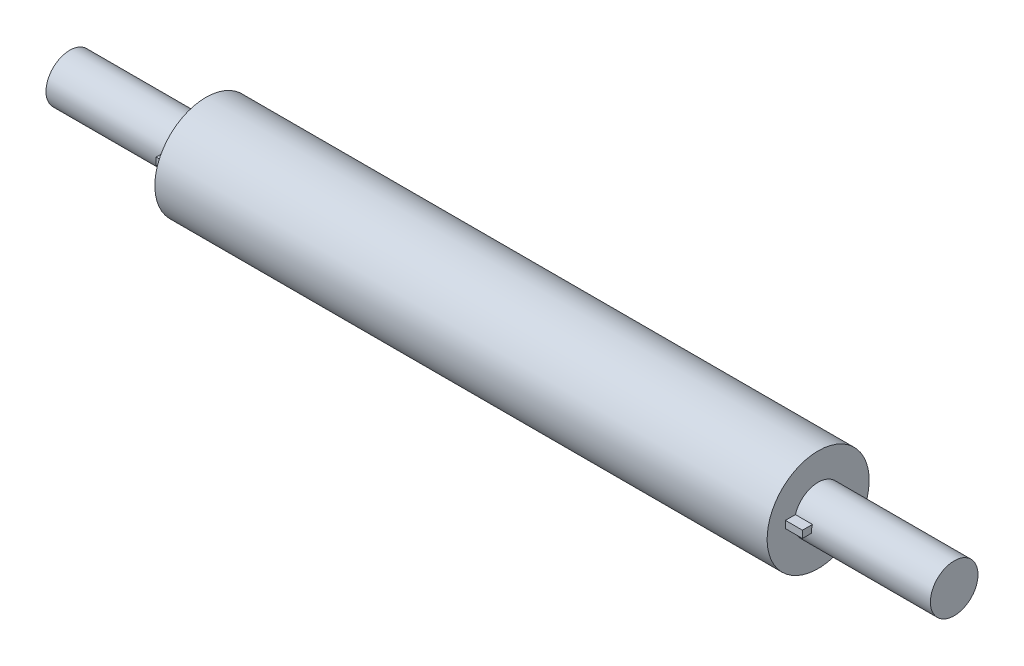
ISO-10303-21;
HEADER;
FILE_DESCRIPTION(('STEP AP214'),'2;1');
FILE_NAME('part.step','',(''),(''),'','','');
FILE_SCHEMA(('AUTOMOTIVE_DESIGN { 1 0 10303 214 1 1 1 1 }'));
ENDSEC;
DATA;
#1=APPLICATION_CONTEXT('core data for automotive mechanical design processes');
#2=APPLICATION_PROTOCOL_DEFINITION('international standard','automotive_design',2000,#1);
#3=PRODUCT_CONTEXT('',#1,'mechanical');
#4=PRODUCT('Part','Part','',(#3));
#5=PRODUCT_RELATED_PRODUCT_CATEGORY('part','',(#4));
#6=PRODUCT_DEFINITION_FORMATION('','',#4);
#7=PRODUCT_DEFINITION_CONTEXT('part definition',#1,'design');
#8=PRODUCT_DEFINITION('design','',#6,#7);
#9=PRODUCT_DEFINITION_SHAPE('','',#8);
#10=(LENGTH_UNIT() NAMED_UNIT(*) SI_UNIT(.MILLI.,.METRE.));
#11=(NAMED_UNIT(*) PLANE_ANGLE_UNIT() SI_UNIT($,.RADIAN.));
#12=(NAMED_UNIT(*) SI_UNIT($,.STERADIAN.) SOLID_ANGLE_UNIT());
#13=UNCERTAINTY_MEASURE_WITH_UNIT(LENGTH_MEASURE(1.E-05),#10,'distance_accuracy_value','');
#14=(GEOMETRIC_REPRESENTATION_CONTEXT(3) GLOBAL_UNCERTAINTY_ASSIGNED_CONTEXT((#13)) GLOBAL_UNIT_ASSIGNED_CONTEXT((#10,
#11,#12)) REPRESENTATION_CONTEXT('',''));
#15=CARTESIAN_POINT('',(0.,0.,0.));
#16=DIRECTION('',(0.,0.,1.));
#17=DIRECTION('',(1.,0.,0.));
#18=AXIS2_PLACEMENT_3D('',#15,#16,#17);
#19=CARTESIAN_POINT('',(90.,-7.00000000000002,0.));
#20=DIRECTION('',(-1.,0.,0.));
#21=DIRECTION('',(0.,-1.,0.));
#22=AXIS2_PLACEMENT_3D('',#19,#20,#21);
#23=PLANE('',#22);
#24=CARTESIAN_POINT('',(90.,0.,0.));
#25=DIRECTION('',(1.,0.,0.));
#26=DIRECTION('',(0.,1.,0.));
#27=AXIS2_PLACEMENT_3D('',#24,#25,#26);
#28=CIRCLE('',#27,15.);
#29=CARTESIAN_POINT('',(90.,15.,0.));
#30=VERTEX_POINT('',#29);
#31=EDGE_CURVE('E155',#30,#30,#28,.T.);
#32=ORIENTED_EDGE('',*,*,#31,.T.);
#33=EDGE_LOOP('',(#32));
#34=FACE_BOUND('',#33,.T.);
#35=DIRECTION('',(0.,0.,1.));
#36=VECTOR('',#35,1.);
#37=CARTESIAN_POINT('',(90.,2.10331663420971,9.61193085525656));
#38=LINE('',#37,#36);
#39=CARTESIAN_POINT('',(90.,2.10331663420971,6.67653047145425));
#40=VERTEX_POINT('',#39);
#41=CARTESIAN_POINT('',(90.,2.10331663420971,9.61193085525656));
#42=VERTEX_POINT('',#41);
#43=EDGE_CURVE('E126',#40,#42,#38,.T.);
#44=ORIENTED_EDGE('',*,*,#43,.F.);
#45=CARTESIAN_POINT('',(90.,0.,0.));
#46=DIRECTION('',(1.,0.,0.));
#47=DIRECTION('',(0.,1.,0.));
#48=AXIS2_PLACEMENT_3D('',#45,#46,#47);
#49=CIRCLE('',#48,7.00000000000002);
#50=CARTESIAN_POINT('',(90.,0.,7.00000000000002));
#51=VERTEX_POINT('',#50);
#52=EDGE_CURVE('E11',#51,#40,#49,.T.);
#53=ORIENTED_EDGE('',*,*,#52,.F.);
#54=DIRECTION('',(0.,0.,-1.));
#55=VECTOR('',#54,1.);
#56=CARTESIAN_POINT('',(90.,0.,7.00000000000002));
#57=LINE('',#56,#55);
#58=CARTESIAN_POINT('',(90.,0.,9.61193085525656));
#59=VERTEX_POINT('',#58);
#60=EDGE_CURVE('E138',#59,#51,#57,.T.);
#61=ORIENTED_EDGE('',*,*,#60,.F.);
#62=DIRECTION('',(0.,-1.,0.));
#63=VECTOR('',#62,1.);
#64=CARTESIAN_POINT('',(90.,0.,9.61193085525656));
#65=LINE('',#64,#63);
#66=EDGE_CURVE('E128',#42,#59,#65,.T.);
#67=ORIENTED_EDGE('',*,*,#66,.F.);
#68=EDGE_LOOP('',(#44,#53,#61,#67));
#69=FACE_BOUND('',#68,.T.);
#70=ADVANCED_FACE('F34',(#34,#69),#23,.F.);
#71=CARTESIAN_POINT('',(130.,0.,0.));
#72=DIRECTION('',(1.,0.,0.));
#73=DIRECTION('',(0.,1.,0.));
#74=AXIS2_PLACEMENT_3D('',#71,#72,#73);
#75=CYLINDRICAL_SURFACE('',#74,7.00000000000001);
#76=CARTESIAN_POINT('',(130.,0.,0.));
#77=DIRECTION('',(1.,0.,0.));
#78=DIRECTION('',(0.,1.,0.));
#79=AXIS2_PLACEMENT_3D('',#76,#77,#78);
#80=CIRCLE('',#79,7.);
#81=CARTESIAN_POINT('',(130.,7.,0.));
#82=VERTEX_POINT('',#81);
#83=EDGE_CURVE('E41',#82,#82,#80,.T.);
#84=ORIENTED_EDGE('',*,*,#83,.F.);
#85=EDGE_LOOP('',(#84));
#86=FACE_BOUND('',#85,.T.);
#87=DIRECTION('',(-1.,0.,0.));
#88=VECTOR('',#87,1.);
#89=CARTESIAN_POINT('',(95.,2.10331663420971,6.67653047145425));
#90=LINE('',#89,#88);
#91=CARTESIAN_POINT('',(95.,2.10331663420971,6.67653047145425));
#92=VERTEX_POINT('',#91);
#93=EDGE_CURVE('E153',#92,#40,#90,.T.);
#94=ORIENTED_EDGE('',*,*,#93,.F.);
#95=CARTESIAN_POINT('',(95.,0.,0.));
#96=DIRECTION('',(-1.,0.,0.));
#97=DIRECTION('',(0.,1.,0.));
#98=AXIS2_PLACEMENT_3D('',#95,#96,#97);
#99=CIRCLE('',#98,7.00000000000002);
#100=CARTESIAN_POINT('',(95.,0.,7.00000000000001));
#101=VERTEX_POINT('',#100);
#102=EDGE_CURVE('E134',#101,#92,#99,.T.);
#103=ORIENTED_EDGE('',*,*,#102,.F.);
#104=DIRECTION('',(-1.,0.,0.));
#105=VECTOR('',#104,1.);
#106=CARTESIAN_POINT('',(95.,0.,7.00000000000002));
#107=LINE('',#106,#105);
#108=EDGE_CURVE('E56',#101,#51,#107,.T.);
#109=ORIENTED_EDGE('',*,*,#108,.T.);
#110=ORIENTED_EDGE('',*,*,#52,.T.);
#111=EDGE_LOOP('',(#94,#103,#109,#110));
#112=FACE_BOUND('',#111,.T.);
#113=ADVANCED_FACE('F169',(#86,#112),#75,.T.);
#114=CARTESIAN_POINT('',(130.,0.,0.));
#115=DIRECTION('',(-1.,0.,0.));
#116=DIRECTION('',(0.,-1.,0.));
#117=AXIS2_PLACEMENT_3D('',#114,#115,#116);
#118=PLANE('',#117);
#119=ORIENTED_EDGE('',*,*,#83,.T.);
#120=EDGE_LOOP('',(#119));
#121=FACE_BOUND('',#120,.T.);
#122=ADVANCED_FACE('F167',(#121),#118,.F.);
#123=CARTESIAN_POINT('',(-130.,0.,0.));
#124=DIRECTION('',(1.,0.,0.));
#125=DIRECTION('',(0.,1.,0.));
#126=AXIS2_PLACEMENT_3D('',#123,#124,#125);
#127=PLANE('',#126);
#128=CARTESIAN_POINT('',(-130.,0.,0.));
#129=DIRECTION('',(1.,0.,0.));
#130=DIRECTION('',(0.,1.,0.));
#131=AXIS2_PLACEMENT_3D('',#128,#129,#130);
#132=CIRCLE('',#131,7.);
#133=CARTESIAN_POINT('',(-130.,7.,0.));
#134=VERTEX_POINT('',#133);
#135=EDGE_CURVE('E162',#134,#134,#132,.T.);
#136=ORIENTED_EDGE('',*,*,#135,.F.);
#137=EDGE_LOOP('',(#136));
#138=FACE_BOUND('',#137,.T.);
#139=ADVANCED_FACE('F265',(#138),#127,.F.);
#140=CARTESIAN_POINT('',(130.,0.,0.));
#141=DIRECTION('',(1.,0.,0.));
#142=DIRECTION('',(0.,1.,0.));
#143=AXIS2_PLACEMENT_3D('',#140,#141,#142);
#144=CYLINDRICAL_SURFACE('',#143,7.);
#145=CARTESIAN_POINT('',(-90.,0.,0.));
#146=DIRECTION('',(1.,0.,0.));
#147=DIRECTION('',(0.,1.,0.));
#148=AXIS2_PLACEMENT_3D('',#145,#146,#147);
#149=CIRCLE('',#148,7.);
#150=CARTESIAN_POINT('',(-90.,0.,7.00000000000002));
#151=VERTEX_POINT('',#150);
#152=CARTESIAN_POINT('',(-90.,2.10331663420971,6.67653047145425));
#153=VERTEX_POINT('',#152);
#154=EDGE_CURVE('E125',#151,#153,#149,.T.);
#155=ORIENTED_EDGE('',*,*,#154,.F.);
#156=DIRECTION('',(1.,0.,0.));
#157=VECTOR('',#156,1.);
#158=CARTESIAN_POINT('',(-95.,0.,7.00000000000002));
#159=LINE('',#158,#157);
#160=CARTESIAN_POINT('',(-95.,0.,7.00000000000002));
#161=VERTEX_POINT('',#160);
#162=EDGE_CURVE('E116',#161,#151,#159,.T.);
#163=ORIENTED_EDGE('',*,*,#162,.F.);
#164=CARTESIAN_POINT('',(-95.,0.,0.));
#165=DIRECTION('',(-1.,0.,0.));
#166=DIRECTION('',(0.,1.,0.));
#167=AXIS2_PLACEMENT_3D('',#164,#165,#166);
#168=CIRCLE('',#167,7.00000000000002);
#169=CARTESIAN_POINT('',(-95.,2.10331663420971,6.67653047145425));
#170=VERTEX_POINT('',#169);
#171=EDGE_CURVE('E100',#161,#170,#168,.T.);
#172=ORIENTED_EDGE('',*,*,#171,.T.);
#173=DIRECTION('',(1.,0.,0.));
#174=VECTOR('',#173,1.);
#175=CARTESIAN_POINT('',(-95.,2.10331663420971,6.67653047145425));
#176=LINE('',#175,#174);
#177=EDGE_CURVE('E221',#170,#153,#176,.T.);
#178=ORIENTED_EDGE('',*,*,#177,.T.);
#179=EDGE_LOOP('',(#155,#163,#172,#178));
#180=FACE_BOUND('',#179,.T.);
#181=ORIENTED_EDGE('',*,*,#135,.T.);
#182=EDGE_LOOP('',(#181));
#183=FACE_BOUND('',#182,.T.);
#184=ADVANCED_FACE('F122',(#180,#183),#144,.T.);
#185=CARTESIAN_POINT('',(-90.,-7.,0.));
#186=DIRECTION('',(1.,0.,0.));
#187=DIRECTION('',(0.,1.,0.));
#188=AXIS2_PLACEMENT_3D('',#185,#186,#187);
#189=PLANE('',#188);
#190=CARTESIAN_POINT('',(-90.,0.,0.));
#191=DIRECTION('',(1.,0.,0.));
#192=DIRECTION('',(0.,1.,0.));
#193=AXIS2_PLACEMENT_3D('',#190,#191,#192);
#194=CIRCLE('',#193,15.);
#195=CARTESIAN_POINT('',(-90.,15.,0.));
#196=VERTEX_POINT('',#195);
#197=EDGE_CURVE('E158',#196,#196,#194,.T.);
#198=ORIENTED_EDGE('',*,*,#197,.F.);
#199=EDGE_LOOP('',(#198));
#200=FACE_BOUND('',#199,.T.);
#201=DIRECTION('',(0.,-1.,0.));
#202=VECTOR('',#201,1.);
#203=CARTESIAN_POINT('',(-90.,0.,9.61193085525656));
#204=LINE('',#203,#202);
#205=CARTESIAN_POINT('',(-90.,2.10331663420971,9.61193085525656));
#206=VERTEX_POINT('',#205);
#207=CARTESIAN_POINT('',(-90.,0.,9.61193085525656));
#208=VERTEX_POINT('',#207);
#209=EDGE_CURVE('E48',#206,#208,#204,.T.);
#210=ORIENTED_EDGE('',*,*,#209,.T.);
#211=DIRECTION('',(0.,0.,-1.));
#212=VECTOR('',#211,1.);
#213=CARTESIAN_POINT('',(-90.,0.,7.00000000000002));
#214=LINE('',#213,#212);
#215=EDGE_CURVE('E215',#208,#151,#214,.T.);
#216=ORIENTED_EDGE('',*,*,#215,.T.);
#217=ORIENTED_EDGE('',*,*,#154,.T.);
#218=DIRECTION('',(0.,0.,1.));
#219=VECTOR('',#218,1.);
#220=CARTESIAN_POINT('',(-90.,2.10331663420971,9.61193085525656));
#221=LINE('',#220,#219);
#222=EDGE_CURVE('E111',#153,#206,#221,.T.);
#223=ORIENTED_EDGE('',*,*,#222,.T.);
#224=EDGE_LOOP('',(#210,#216,#217,#223));
#225=FACE_BOUND('',#224,.T.);
#226=ADVANCED_FACE('F207',(#200,#225),#189,.F.);
#227=CARTESIAN_POINT('',(130.,0.,0.));
#228=DIRECTION('',(1.,0.,0.));
#229=DIRECTION('',(0.,1.,0.));
#230=AXIS2_PLACEMENT_3D('',#227,#228,#229);
#231=CYLINDRICAL_SURFACE('',#230,15.);
#232=ORIENTED_EDGE('',*,*,#31,.F.);
#233=EDGE_LOOP('',(#232));
#234=FACE_BOUND('',#233,.T.);
#235=ORIENTED_EDGE('',*,*,#197,.T.);
#236=EDGE_LOOP('',(#235));
#237=FACE_BOUND('',#236,.T.);
#238=ADVANCED_FACE('F204',(#234,#237),#231,.T.);
#239=CARTESIAN_POINT('',(95.,2.10331663420971,9.61193085525656));
#240=DIRECTION('',(0.,-1.,0.));
#241=DIRECTION('',(1.,0.,0.));
#242=AXIS2_PLACEMENT_3D('',#239,#240,#241);
#243=PLANE('',#242);
#244=ORIENTED_EDGE('',*,*,#43,.T.);
#245=DIRECTION('',(-1.,0.,0.));
#246=VECTOR('',#245,1.);
#247=CARTESIAN_POINT('',(95.,2.10331663420971,9.61193085525656));
#248=LINE('',#247,#246);
#249=CARTESIAN_POINT('',(95.,2.10331663420971,9.61193085525656));
#250=VERTEX_POINT('',#249);
#251=EDGE_CURVE('E150',#250,#42,#248,.T.);
#252=ORIENTED_EDGE('',*,*,#251,.F.);
#253=DIRECTION('',(0.,0.,1.));
#254=VECTOR('',#253,1.);
#255=CARTESIAN_POINT('',(95.,2.10331663420971,9.61193085525656));
#256=LINE('',#255,#254);
#257=EDGE_CURVE('E137',#92,#250,#256,.T.);
#258=ORIENTED_EDGE('',*,*,#257,.F.);
#259=ORIENTED_EDGE('',*,*,#93,.T.);
#260=EDGE_LOOP('',(#244,#252,#258,#259));
#261=FACE_BOUND('',#260,.T.);
#262=ADVANCED_FACE('F177',(#261),#243,.F.);
#263=CARTESIAN_POINT('',(95.,0.,9.61193085525656));
#264=DIRECTION('',(0.,0.,-1.));
#265=DIRECTION('',(-1.,0.,0.));
#266=AXIS2_PLACEMENT_3D('',#263,#264,#265);
#267=PLANE('',#266);
#268=ORIENTED_EDGE('',*,*,#66,.T.);
#269=DIRECTION('',(-1.,0.,0.));
#270=VECTOR('',#269,1.);
#271=CARTESIAN_POINT('',(95.,0.,9.61193085525656));
#272=LINE('',#271,#270);
#273=CARTESIAN_POINT('',(95.,0.,9.61193085525656));
#274=VERTEX_POINT('',#273);
#275=EDGE_CURVE('E147',#274,#59,#272,.T.);
#276=ORIENTED_EDGE('',*,*,#275,.F.);
#277=DIRECTION('',(0.,-1.,0.));
#278=VECTOR('',#277,1.);
#279=CARTESIAN_POINT('',(95.,0.,9.61193085525656));
#280=LINE('',#279,#278);
#281=EDGE_CURVE('E140',#250,#274,#280,.T.);
#282=ORIENTED_EDGE('',*,*,#281,.F.);
#283=ORIENTED_EDGE('',*,*,#251,.T.);
#284=EDGE_LOOP('',(#268,#276,#282,#283));
#285=FACE_BOUND('',#284,.T.);
#286=ADVANCED_FACE('F184',(#285),#267,.F.);
#287=CARTESIAN_POINT('',(95.,0.,7.00000000000002));
#288=DIRECTION('',(0.,1.,0.));
#289=DIRECTION('',(-1.,0.,0.));
#290=AXIS2_PLACEMENT_3D('',#287,#288,#289);
#291=PLANE('',#290);
#292=ORIENTED_EDGE('',*,*,#60,.T.);
#293=ORIENTED_EDGE('',*,*,#108,.F.);
#294=DIRECTION('',(0.,0.,-1.));
#295=VECTOR('',#294,1.);
#296=CARTESIAN_POINT('',(95.,0.,7.00000000000002));
#297=LINE('',#296,#295);
#298=EDGE_CURVE('E142',#274,#101,#297,.T.);
#299=ORIENTED_EDGE('',*,*,#298,.F.);
#300=ORIENTED_EDGE('',*,*,#275,.T.);
#301=EDGE_LOOP('',(#292,#293,#299,#300));
#302=FACE_BOUND('',#301,.T.);
#303=ADVANCED_FACE('F186',(#302),#291,.F.);
#304=CARTESIAN_POINT('',(95.,0.,0.));
#305=DIRECTION('',(1.,0.,0.));
#306=DIRECTION('',(0.,1.,0.));
#307=AXIS2_PLACEMENT_3D('',#304,#305,#306);
#308=PLANE('',#307);
#309=ORIENTED_EDGE('',*,*,#102,.T.);
#310=ORIENTED_EDGE('',*,*,#257,.T.);
#311=ORIENTED_EDGE('',*,*,#281,.T.);
#312=ORIENTED_EDGE('',*,*,#298,.T.);
#313=EDGE_LOOP('',(#309,#310,#311,#312));
#314=FACE_BOUND('',#313,.T.);
#315=ADVANCED_FACE('F188',(#314),#308,.T.);
#316=CARTESIAN_POINT('',(-95.,0.,7.00000000000002));
#317=DIRECTION('',(0.,-1.,0.));
#318=DIRECTION('',(1.,0.,0.));
#319=AXIS2_PLACEMENT_3D('',#316,#317,#318);
#320=PLANE('',#319);
#321=ORIENTED_EDGE('',*,*,#215,.F.);
#322=DIRECTION('',(1.,0.,0.));
#323=VECTOR('',#322,1.);
#324=CARTESIAN_POINT('',(-95.,0.,9.61193085525656));
#325=LINE('',#324,#323);
#326=CARTESIAN_POINT('',(-95.,0.,9.61193085525656));
#327=VERTEX_POINT('',#326);
#328=EDGE_CURVE('E118',#327,#208,#325,.T.);
#329=ORIENTED_EDGE('',*,*,#328,.F.);
#330=DIRECTION('',(0.,0.,-1.));
#331=VECTOR('',#330,1.);
#332=CARTESIAN_POINT('',(-95.,0.,7.00000000000002));
#333=LINE('',#332,#331);
#334=EDGE_CURVE('E104',#327,#161,#333,.T.);
#335=ORIENTED_EDGE('',*,*,#334,.T.);
#336=ORIENTED_EDGE('',*,*,#162,.T.);
#337=EDGE_LOOP('',(#321,#329,#335,#336));
#338=FACE_BOUND('',#337,.T.);
#339=ADVANCED_FACE('F115',(#338),#320,.T.);
#340=CARTESIAN_POINT('',(-95.,0.,9.61193085525656));
#341=DIRECTION('',(0.,0.,1.));
#342=DIRECTION('',(1.,0.,0.));
#343=AXIS2_PLACEMENT_3D('',#340,#341,#342);
#344=PLANE('',#343);
#345=ORIENTED_EDGE('',*,*,#209,.F.);
#346=DIRECTION('',(1.,0.,0.));
#347=VECTOR('',#346,1.);
#348=CARTESIAN_POINT('',(-95.,2.10331663420971,9.61193085525656));
#349=LINE('',#348,#347);
#350=CARTESIAN_POINT('',(-95.,2.10331663420971,9.61193085525656));
#351=VERTEX_POINT('',#350);
#352=EDGE_CURVE('E130',#351,#206,#349,.T.);
#353=ORIENTED_EDGE('',*,*,#352,.F.);
#354=DIRECTION('',(0.,-1.,0.));
#355=VECTOR('',#354,1.);
#356=CARTESIAN_POINT('',(-95.,0.,9.61193085525656));
#357=LINE('',#356,#355);
#358=EDGE_CURVE('E119',#351,#327,#357,.T.);
#359=ORIENTED_EDGE('',*,*,#358,.T.);
#360=ORIENTED_EDGE('',*,*,#328,.T.);
#361=EDGE_LOOP('',(#345,#353,#359,#360));
#362=FACE_BOUND('',#361,.T.);
#363=ADVANCED_FACE('F195',(#362),#344,.T.);
#364=CARTESIAN_POINT('',(-95.,2.10331663420971,9.61193085525656));
#365=DIRECTION('',(0.,1.,0.));
#366=DIRECTION('',(-1.,0.,0.));
#367=AXIS2_PLACEMENT_3D('',#364,#365,#366);
#368=PLANE('',#367);
#369=ORIENTED_EDGE('',*,*,#222,.F.);
#370=ORIENTED_EDGE('',*,*,#177,.F.);
#371=DIRECTION('',(0.,0.,1.));
#372=VECTOR('',#371,1.);
#373=CARTESIAN_POINT('',(-95.,2.10331663420971,9.61193085525656));
#374=LINE('',#373,#372);
#375=EDGE_CURVE('E107',#170,#351,#374,.T.);
#376=ORIENTED_EDGE('',*,*,#375,.T.);
#377=ORIENTED_EDGE('',*,*,#352,.T.);
#378=EDGE_LOOP('',(#369,#370,#376,#377));
#379=FACE_BOUND('',#378,.T.);
#380=ADVANCED_FACE('F223',(#379),#368,.T.);
#381=CARTESIAN_POINT('',(-95.,0.,0.));
#382=DIRECTION('',(-1.,0.,0.));
#383=DIRECTION('',(0.,1.,0.));
#384=AXIS2_PLACEMENT_3D('',#381,#382,#383);
#385=PLANE('',#384);
#386=ORIENTED_EDGE('',*,*,#171,.F.);
#387=ORIENTED_EDGE('',*,*,#334,.F.);
#388=ORIENTED_EDGE('',*,*,#358,.F.);
#389=ORIENTED_EDGE('',*,*,#375,.F.);
#390=EDGE_LOOP('',(#386,#387,#388,#389));
#391=FACE_BOUND('',#390,.T.);
#392=ADVANCED_FACE('F102',(#391),#385,.T.);
#393=CLOSED_SHELL('',(#70,#113,#122,#139,#184,#226,#238,#262,#286,#303,#315,#339,#363,#380,#392));
#394=MANIFOLD_SOLID_BREP('B2',#393);
#395=ADVANCED_BREP_SHAPE_REPRESENTATION('',(#18,#394),#14);
#396=SHAPE_DEFINITION_REPRESENTATION(#9,#395);
ENDSEC;
END-ISO-10303-21;
